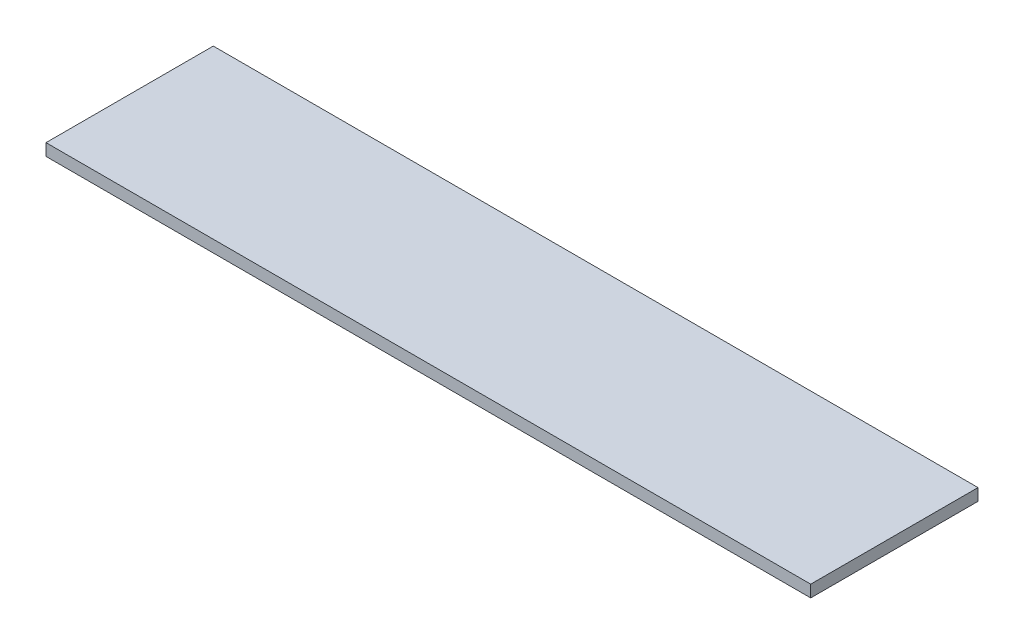
ISO-10303-21;
HEADER;
FILE_DESCRIPTION(('STEP AP214'),'2;1');
FILE_NAME('part.step','',(''),(''),'','','');
FILE_SCHEMA(('AUTOMOTIVE_DESIGN { 1 0 10303 214 1 1 1 1 }'));
ENDSEC;
DATA;
#1=APPLICATION_CONTEXT('core data for automotive mechanical design processes');
#2=APPLICATION_PROTOCOL_DEFINITION('international standard','automotive_design',2000,#1);
#3=PRODUCT_CONTEXT('',#1,'mechanical');
#4=PRODUCT('Part','Part','',(#3));
#5=PRODUCT_RELATED_PRODUCT_CATEGORY('part','',(#4));
#6=PRODUCT_DEFINITION_FORMATION('','',#4);
#7=PRODUCT_DEFINITION_CONTEXT('part definition',#1,'design');
#8=PRODUCT_DEFINITION('design','',#6,#7);
#9=PRODUCT_DEFINITION_SHAPE('','',#8);
#10=(LENGTH_UNIT() NAMED_UNIT(*) SI_UNIT(.MILLI.,.METRE.));
#11=(NAMED_UNIT(*) PLANE_ANGLE_UNIT() SI_UNIT($,.RADIAN.));
#12=(NAMED_UNIT(*) SI_UNIT($,.STERADIAN.) SOLID_ANGLE_UNIT());
#13=UNCERTAINTY_MEASURE_WITH_UNIT(LENGTH_MEASURE(1.E-05),#10,'distance_accuracy_value','');
#14=(GEOMETRIC_REPRESENTATION_CONTEXT(3) GLOBAL_UNCERTAINTY_ASSIGNED_CONTEXT((#13)) GLOBAL_UNIT_ASSIGNED_CONTEXT((#10,
#11,#12)) REPRESENTATION_CONTEXT('',''));
#15=CARTESIAN_POINT('',(0.,0.,0.));
#16=DIRECTION('',(0.,0.,1.));
#17=DIRECTION('',(1.,0.,0.));
#18=AXIS2_PLACEMENT_3D('',#15,#16,#17);
#19=CARTESIAN_POINT('',(0.,19.05,0.));
#20=DIRECTION('',(1.,0.,0.));
#21=DIRECTION('',(0.,0.,-1.));
#22=AXIS2_PLACEMENT_3D('',#19,#20,#21);
#23=PLANE('',#22);
#24=DIRECTION('',(0.,0.,1.));
#25=VECTOR('',#24,1.);
#26=CARTESIAN_POINT('',(0.,0.,0.));
#27=LINE('',#26,#25);
#28=CARTESIAN_POINT('',(0.,0.,-266.7));
#29=VERTEX_POINT('',#28);
#30=CARTESIAN_POINT('',(0.,0.,0.));
#31=VERTEX_POINT('',#30);
#32=EDGE_CURVE('E113',#29,#31,#27,.T.);
#33=ORIENTED_EDGE('',*,*,#32,.T.);
#34=DIRECTION('',(0.,-1.,0.));
#35=VECTOR('',#34,1.);
#36=CARTESIAN_POINT('',(0.,19.05,0.));
#37=LINE('',#36,#35);
#38=CARTESIAN_POINT('',(0.,19.05,0.));
#39=VERTEX_POINT('',#38);
#40=EDGE_CURVE('E11',#39,#31,#37,.T.);
#41=ORIENTED_EDGE('',*,*,#40,.F.);
#42=DIRECTION('',(0.,0.,1.));
#43=VECTOR('',#42,1.);
#44=CARTESIAN_POINT('',(0.,19.05,0.));
#45=LINE('',#44,#43);
#46=CARTESIAN_POINT('',(0.,19.05,-266.7));
#47=VERTEX_POINT('',#46);
#48=EDGE_CURVE('E97',#47,#39,#45,.T.);
#49=ORIENTED_EDGE('',*,*,#48,.F.);
#50=DIRECTION('',(0.,-1.,0.));
#51=VECTOR('',#50,1.);
#52=CARTESIAN_POINT('',(0.,19.05,-266.7));
#53=LINE('',#52,#51);
#54=EDGE_CURVE('E109',#47,#29,#53,.T.);
#55=ORIENTED_EDGE('',*,*,#54,.T.);
#56=EDGE_LOOP('',(#33,#41,#49,#55));
#57=FACE_BOUND('',#56,.T.);
#58=ADVANCED_FACE('F45',(#57),#23,.F.);
#59=CARTESIAN_POINT('',(0.,19.05,0.));
#60=DIRECTION('',(0.,0.,-1.));
#61=DIRECTION('',(-1.,0.,0.));
#62=AXIS2_PLACEMENT_3D('',#59,#60,#61);
#63=PLANE('',#62);
#64=DIRECTION('',(1.,0.,0.));
#65=VECTOR('',#64,1.);
#66=CARTESIAN_POINT('',(0.,0.,0.));
#67=LINE('',#66,#65);
#68=CARTESIAN_POINT('',(1219.2,0.,0.));
#69=VERTEX_POINT('',#68);
#70=EDGE_CURVE('E102',#31,#69,#67,.T.);
#71=ORIENTED_EDGE('',*,*,#70,.T.);
#72=DIRECTION('',(0.,-1.,0.));
#73=VECTOR('',#72,1.);
#74=CARTESIAN_POINT('',(1219.2,19.05,0.));
#75=LINE('',#74,#73);
#76=CARTESIAN_POINT('',(1219.2,19.05,0.));
#77=VERTEX_POINT('',#76);
#78=EDGE_CURVE('E54',#77,#69,#75,.T.);
#79=ORIENTED_EDGE('',*,*,#78,.F.);
#80=DIRECTION('',(1.,0.,0.));
#81=VECTOR('',#80,1.);
#82=CARTESIAN_POINT('',(0.,19.05,0.));
#83=LINE('',#82,#81);
#84=EDGE_CURVE('E92',#39,#77,#83,.T.);
#85=ORIENTED_EDGE('',*,*,#84,.F.);
#86=ORIENTED_EDGE('',*,*,#40,.T.);
#87=EDGE_LOOP('',(#71,#79,#85,#86));
#88=FACE_BOUND('',#87,.T.);
#89=ADVANCED_FACE('F101',(#88),#63,.F.);
#90=CARTESIAN_POINT('',(1219.2,19.05,0.));
#91=DIRECTION('',(-1.,0.,0.));
#92=DIRECTION('',(0.,0.,1.));
#93=AXIS2_PLACEMENT_3D('',#90,#91,#92);
#94=PLANE('',#93);
#95=DIRECTION('',(0.,0.,-1.));
#96=VECTOR('',#95,1.);
#97=CARTESIAN_POINT('',(1219.2,0.,0.));
#98=LINE('',#97,#96);
#99=CARTESIAN_POINT('',(1219.2,0.,-266.7));
#100=VERTEX_POINT('',#99);
#101=EDGE_CURVE('E79',#69,#100,#98,.T.);
#102=ORIENTED_EDGE('',*,*,#101,.T.);
#103=DIRECTION('',(0.,-1.,0.));
#104=VECTOR('',#103,1.);
#105=CARTESIAN_POINT('',(1219.2,19.05,-266.7));
#106=LINE('',#105,#104);
#107=CARTESIAN_POINT('',(1219.2,19.05,-266.7));
#108=VERTEX_POINT('',#107);
#109=EDGE_CURVE('E104',#108,#100,#106,.T.);
#110=ORIENTED_EDGE('',*,*,#109,.F.);
#111=DIRECTION('',(0.,0.,-1.));
#112=VECTOR('',#111,1.);
#113=CARTESIAN_POINT('',(1219.2,19.05,0.));
#114=LINE('',#113,#112);
#115=EDGE_CURVE('E95',#77,#108,#114,.T.);
#116=ORIENTED_EDGE('',*,*,#115,.F.);
#117=ORIENTED_EDGE('',*,*,#78,.T.);
#118=EDGE_LOOP('',(#102,#110,#116,#117));
#119=FACE_BOUND('',#118,.T.);
#120=ADVANCED_FACE('F105',(#119),#94,.F.);
#121=CARTESIAN_POINT('',(0.,19.05,-266.7));
#122=DIRECTION('',(0.,0.,1.));
#123=DIRECTION('',(1.,0.,0.));
#124=AXIS2_PLACEMENT_3D('',#121,#122,#123);
#125=PLANE('',#124);
#126=DIRECTION('',(-1.,0.,0.));
#127=VECTOR('',#126,1.);
#128=CARTESIAN_POINT('',(0.,0.,-266.7));
#129=LINE('',#128,#127);
#130=EDGE_CURVE('E85',#100,#29,#129,.T.);
#131=ORIENTED_EDGE('',*,*,#130,.T.);
#132=ORIENTED_EDGE('',*,*,#54,.F.);
#133=DIRECTION('',(-1.,0.,0.));
#134=VECTOR('',#133,1.);
#135=CARTESIAN_POINT('',(0.,19.05,-266.7));
#136=LINE('',#135,#134);
#137=EDGE_CURVE('E62',#108,#47,#136,.T.);
#138=ORIENTED_EDGE('',*,*,#137,.F.);
#139=ORIENTED_EDGE('',*,*,#109,.T.);
#140=EDGE_LOOP('',(#131,#132,#138,#139));
#141=FACE_BOUND('',#140,.T.);
#142=ADVANCED_FACE('F126',(#141),#125,.F.);
#143=CARTESIAN_POINT('',(0.,19.05,0.));
#144=DIRECTION('',(0.,-1.,0.));
#145=DIRECTION('',(0.,0.,-1.));
#146=AXIS2_PLACEMENT_3D('',#143,#144,#145);
#147=PLANE('',#146);
#148=ORIENTED_EDGE('',*,*,#48,.T.);
#149=ORIENTED_EDGE('',*,*,#84,.T.);
#150=ORIENTED_EDGE('',*,*,#115,.T.);
#151=ORIENTED_EDGE('',*,*,#137,.T.);
#152=EDGE_LOOP('',(#148,#149,#150,#151));
#153=FACE_BOUND('',#152,.T.);
#154=ADVANCED_FACE('F93',(#153),#147,.F.);
#155=CARTESIAN_POINT('',(0.,0.,0.));
#156=DIRECTION('',(0.,-1.,0.));
#157=DIRECTION('',(0.,0.,-1.));
#158=AXIS2_PLACEMENT_3D('',#155,#156,#157);
#159=PLANE('',#158);
#160=ORIENTED_EDGE('',*,*,#32,.F.);
#161=ORIENTED_EDGE('',*,*,#130,.F.);
#162=ORIENTED_EDGE('',*,*,#101,.F.);
#163=ORIENTED_EDGE('',*,*,#70,.F.);
#164=EDGE_LOOP('',(#160,#161,#162,#163));
#165=FACE_BOUND('',#164,.T.);
#166=ADVANCED_FACE('F129',(#165),#159,.T.);
#167=CLOSED_SHELL('',(#58,#89,#120,#142,#154,#166));
#168=MANIFOLD_SOLID_BREP('B2',#167);
#169=ADVANCED_BREP_SHAPE_REPRESENTATION('',(#18,#168),#14);
#170=SHAPE_DEFINITION_REPRESENTATION(#9,#169);
ENDSEC;
END-ISO-10303-21;
